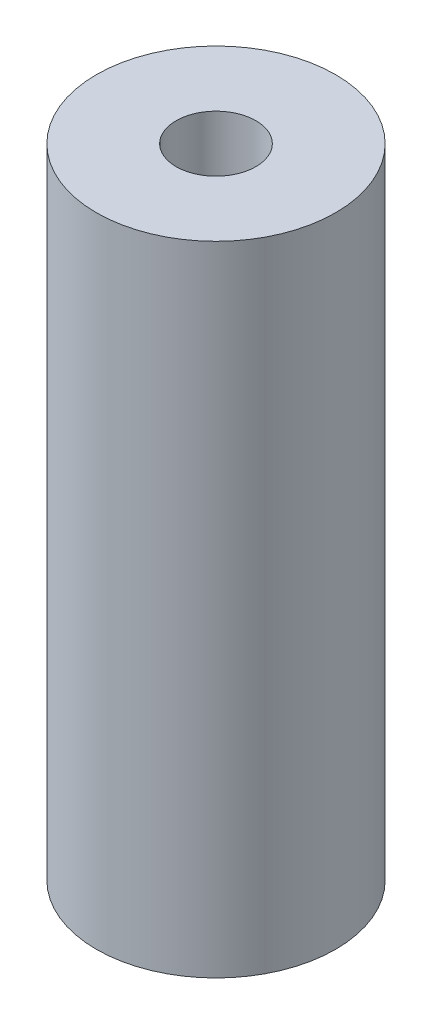
ISO-10303-21;
HEADER;
FILE_DESCRIPTION(('STEP AP214'),'2;1');
FILE_NAME('part.step','',(''),(''),'','','');
FILE_SCHEMA(('AUTOMOTIVE_DESIGN { 1 0 10303 214 1 1 1 1 }'));
ENDSEC;
DATA;
#1=APPLICATION_CONTEXT('core data for automotive mechanical design processes');
#2=APPLICATION_PROTOCOL_DEFINITION('international standard','automotive_design',2000,#1);
#3=PRODUCT_CONTEXT('',#1,'mechanical');
#4=PRODUCT('Part','Part','',(#3));
#5=PRODUCT_RELATED_PRODUCT_CATEGORY('part','',(#4));
#6=PRODUCT_DEFINITION_FORMATION('','',#4);
#7=PRODUCT_DEFINITION_CONTEXT('part definition',#1,'design');
#8=PRODUCT_DEFINITION('design','',#6,#7);
#9=PRODUCT_DEFINITION_SHAPE('','',#8);
#10=(LENGTH_UNIT() NAMED_UNIT(*) SI_UNIT(.MILLI.,.METRE.));
#11=(NAMED_UNIT(*) PLANE_ANGLE_UNIT() SI_UNIT($,.RADIAN.));
#12=(NAMED_UNIT(*) SI_UNIT($,.STERADIAN.) SOLID_ANGLE_UNIT());
#13=UNCERTAINTY_MEASURE_WITH_UNIT(LENGTH_MEASURE(1.E-05),#10,'distance_accuracy_value','');
#14=(GEOMETRIC_REPRESENTATION_CONTEXT(3) GLOBAL_UNCERTAINTY_ASSIGNED_CONTEXT((#13)) GLOBAL_UNIT_ASSIGNED_CONTEXT((#10,
#11,#12)) REPRESENTATION_CONTEXT('',''));
#15=CARTESIAN_POINT('',(0.,0.,0.));
#16=DIRECTION('',(0.,0.,1.));
#17=DIRECTION('',(1.,0.,0.));
#18=AXIS2_PLACEMENT_3D('',#15,#16,#17);
#19=CARTESIAN_POINT('',(0.,24.,0.));
#20=DIRECTION('',(0.,1.,0.));
#21=DIRECTION('',(0.,0.,1.));
#22=AXIS2_PLACEMENT_3D('',#19,#20,#21);
#23=PLANE('',#22);
#24=CARTESIAN_POINT('',(0.,24.,0.));
#25=DIRECTION('',(0.,1.,0.));
#26=DIRECTION('',(0.,0.,1.));
#27=AXIS2_PLACEMENT_3D('',#24,#25,#26);
#28=CIRCLE('',#27,4.5);
#29=CARTESIAN_POINT('',(0.,24.,4.5));
#30=VERTEX_POINT('',#29);
#31=EDGE_CURVE('E10',#30,#30,#28,.T.);
#32=ORIENTED_EDGE('',*,*,#31,.T.);
#33=EDGE_LOOP('',(#32));
#34=FACE_BOUND('',#33,.T.);
#35=CARTESIAN_POINT('',(0.,24.,0.));
#36=DIRECTION('',(0.,1.,0.));
#37=DIRECTION('',(0.,0.,1.));
#38=AXIS2_PLACEMENT_3D('',#35,#36,#37);
#39=CIRCLE('',#38,1.5);
#40=CARTESIAN_POINT('',(0.,24.,1.5));
#41=VERTEX_POINT('',#40);
#42=EDGE_CURVE('E44',#41,#41,#39,.T.);
#43=ORIENTED_EDGE('',*,*,#42,.F.);
#44=EDGE_LOOP('',(#43));
#45=FACE_BOUND('',#44,.T.);
#46=ADVANCED_FACE('F33',(#34,#45),#23,.T.);
#47=CARTESIAN_POINT('',(0.,0.,0.));
#48=DIRECTION('',(0.,1.,0.));
#49=DIRECTION('',(0.,0.,1.));
#50=AXIS2_PLACEMENT_3D('',#47,#48,#49);
#51=PLANE('',#50);
#52=CARTESIAN_POINT('',(0.,0.,0.));
#53=DIRECTION('',(0.,1.,0.));
#54=DIRECTION('',(0.,0.,1.));
#55=AXIS2_PLACEMENT_3D('',#52,#53,#54);
#56=CIRCLE('',#55,4.5);
#57=CARTESIAN_POINT('',(0.,0.,4.5));
#58=VERTEX_POINT('',#57);
#59=EDGE_CURVE('E37',#58,#58,#56,.T.);
#60=ORIENTED_EDGE('',*,*,#59,.F.);
#61=EDGE_LOOP('',(#60));
#62=FACE_BOUND('',#61,.T.);
#63=CARTESIAN_POINT('',(0.,0.,0.));
#64=DIRECTION('',(0.,1.,0.));
#65=DIRECTION('',(0.,0.,1.));
#66=AXIS2_PLACEMENT_3D('',#63,#64,#65);
#67=CIRCLE('',#66,1.5);
#68=CARTESIAN_POINT('',(0.,0.,1.5));
#69=VERTEX_POINT('',#68);
#70=EDGE_CURVE('E46',#69,#69,#67,.T.);
#71=ORIENTED_EDGE('',*,*,#70,.T.);
#72=EDGE_LOOP('',(#71));
#73=FACE_BOUND('',#72,.T.);
#74=ADVANCED_FACE('F56',(#62,#73),#51,.F.);
#75=CARTESIAN_POINT('',(0.,24.,0.));
#76=DIRECTION('',(0.,-1.,0.));
#77=DIRECTION('',(0.,0.,-1.));
#78=AXIS2_PLACEMENT_3D('',#75,#76,#77);
#79=CYLINDRICAL_SURFACE('',#78,4.5);
#80=ORIENTED_EDGE('',*,*,#31,.F.);
#81=EDGE_LOOP('',(#80));
#82=FACE_BOUND('',#81,.T.);
#83=ORIENTED_EDGE('',*,*,#59,.T.);
#84=EDGE_LOOP('',(#83));
#85=FACE_BOUND('',#84,.T.);
#86=ADVANCED_FACE('F35',(#82,#85),#79,.T.);
#87=CARTESIAN_POINT('',(0.,24.,0.));
#88=DIRECTION('',(0.,-1.,0.));
#89=DIRECTION('',(0.,0.,-1.));
#90=AXIS2_PLACEMENT_3D('',#87,#88,#89);
#91=CYLINDRICAL_SURFACE('',#90,1.5);
#92=ORIENTED_EDGE('',*,*,#42,.T.);
#93=EDGE_LOOP('',(#92));
#94=FACE_BOUND('',#93,.T.);
#95=ORIENTED_EDGE('',*,*,#70,.F.);
#96=EDGE_LOOP('',(#95));
#97=FACE_BOUND('',#96,.T.);
#98=ADVANCED_FACE('F52',(#94,#97),#91,.F.);
#99=CLOSED_SHELL('',(#46,#74,#86,#98));
#100=MANIFOLD_SOLID_BREP('B2',#99);
#101=ADVANCED_BREP_SHAPE_REPRESENTATION('',(#18,#100),#14);
#102=SHAPE_DEFINITION_REPRESENTATION(#9,#101);
ENDSEC;
END-ISO-10303-21;
